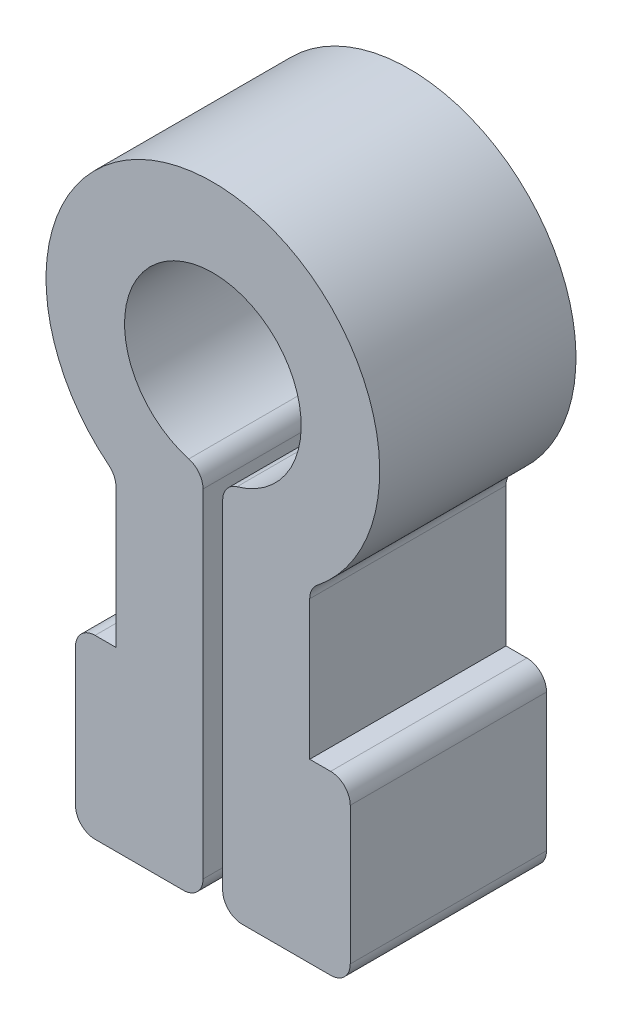
ISO-10303-21;
HEADER;
FILE_DESCRIPTION(('STEP AP214'),'2;1');
FILE_NAME('part.step','',(''),(''),'','','');
FILE_SCHEMA(('AUTOMOTIVE_DESIGN { 1 0 10303 214 1 1 1 1 }'));
ENDSEC;
DATA;
#1=APPLICATION_CONTEXT('core data for automotive mechanical design processes');
#2=APPLICATION_PROTOCOL_DEFINITION('international standard','automotive_design',2000,#1);
#3=PRODUCT_CONTEXT('',#1,'mechanical');
#4=PRODUCT('Part','Part','',(#3));
#5=PRODUCT_RELATED_PRODUCT_CATEGORY('part','',(#4));
#6=PRODUCT_DEFINITION_FORMATION('','',#4);
#7=PRODUCT_DEFINITION_CONTEXT('part definition',#1,'design');
#8=PRODUCT_DEFINITION('design','',#6,#7);
#9=PRODUCT_DEFINITION_SHAPE('','',#8);
#10=(LENGTH_UNIT() NAMED_UNIT(*) SI_UNIT(.MILLI.,.METRE.));
#11=(NAMED_UNIT(*) PLANE_ANGLE_UNIT() SI_UNIT($,.RADIAN.));
#12=(NAMED_UNIT(*) SI_UNIT($,.STERADIAN.) SOLID_ANGLE_UNIT());
#13=UNCERTAINTY_MEASURE_WITH_UNIT(LENGTH_MEASURE(1.E-05),#10,'distance_accuracy_value','');
#14=(GEOMETRIC_REPRESENTATION_CONTEXT(3) GLOBAL_UNCERTAINTY_ASSIGNED_CONTEXT((#13)) GLOBAL_UNIT_ASSIGNED_CONTEXT((#10,
#11,#12)) REPRESENTATION_CONTEXT('',''));
#15=CARTESIAN_POINT('',(0.,0.,0.));
#16=DIRECTION('',(0.,0.,1.));
#17=DIRECTION('',(1.,0.,0.));
#18=AXIS2_PLACEMENT_3D('',#15,#16,#17);
#19=CARTESIAN_POINT('',(1.5,-5.29150262212918,10.));
#20=DIRECTION('',(0.,0.,-1.));
#21=DIRECTION('',(-1.,0.,0.));
#22=AXIS2_PLACEMENT_3D('',#19,#20,#21);
#23=CYLINDRICAL_SURFACE('',#22,1.);
#24=CARTESIAN_POINT('',(1.5,-5.29150262212918,0.));
#25=DIRECTION('',(0.,0.,-1.));
#26=DIRECTION('',(-1.,0.,0.));
#27=AXIS2_PLACEMENT_3D('',#24,#25,#26);
#28=CIRCLE('',#27,1.);
#29=CARTESIAN_POINT('',(0.5,-5.29150262212918,0.));
#30=VERTEX_POINT('',#29);
#31=CARTESIAN_POINT('',(1.22727272727273,-4.32941123628751,0.));
#32=VERTEX_POINT('',#31);
#33=EDGE_CURVE('E223',#30,#32,#28,.T.);
#34=ORIENTED_EDGE('',*,*,#33,.F.);
#35=DIRECTION('',(0.,0.,-1.));
#36=VECTOR('',#35,1.);
#37=CARTESIAN_POINT('',(0.5,-5.29150262212918,10.));
#38=LINE('',#37,#36);
#39=CARTESIAN_POINT('',(0.5,-5.29150262212918,10.));
#40=VERTEX_POINT('',#39);
#41=EDGE_CURVE('E11',#40,#30,#38,.T.);
#42=ORIENTED_EDGE('',*,*,#41,.F.);
#43=CARTESIAN_POINT('',(1.5,-5.29150262212918,10.));
#44=DIRECTION('',(0.,0.,-1.));
#45=DIRECTION('',(-1.,0.,0.));
#46=AXIS2_PLACEMENT_3D('',#43,#44,#45);
#47=CIRCLE('',#46,1.);
#48=CARTESIAN_POINT('',(1.22727272727273,-4.32941123628751,10.));
#49=VERTEX_POINT('',#48);
#50=EDGE_CURVE('E299',#40,#49,#47,.T.);
#51=ORIENTED_EDGE('',*,*,#50,.T.);
#52=DIRECTION('',(0.,0.,-1.));
#53=VECTOR('',#52,1.);
#54=CARTESIAN_POINT('',(1.22727272727273,-4.32941123628751,10.));
#55=LINE('',#54,#53);
#56=EDGE_CURVE('E42',#49,#32,#55,.T.);
#57=ORIENTED_EDGE('',*,*,#56,.T.);
#58=EDGE_LOOP('',(#34,#42,#51,#57));
#59=FACE_BOUND('',#58,.T.);
#60=ADVANCED_FACE('F39',(#59),#23,.T.);
#61=CARTESIAN_POINT('',(0.5,-5.29150262212918,10.));
#62=DIRECTION('',(1.,0.,0.));
#63=DIRECTION('',(0.,1.,0.));
#64=AXIS2_PLACEMENT_3D('',#61,#62,#63);
#65=PLANE('',#64);
#66=DIRECTION('',(0.,-1.,0.));
#67=VECTOR('',#66,1.);
#68=CARTESIAN_POINT('',(0.5,-5.29150262212918,0.));
#69=LINE('',#68,#67);
#70=CARTESIAN_POINT('',(0.5,-22.5,0.));
#71=VERTEX_POINT('',#70);
#72=EDGE_CURVE('E297',#30,#71,#69,.T.);
#73=ORIENTED_EDGE('',*,*,#72,.T.);
#74=DIRECTION('',(0.,0.,-1.));
#75=VECTOR('',#74,1.);
#76=CARTESIAN_POINT('',(0.5,-22.5,10.));
#77=LINE('',#76,#75);
#78=CARTESIAN_POINT('',(0.5,-22.5,10.));
#79=VERTEX_POINT('',#78);
#80=EDGE_CURVE('E49',#79,#71,#77,.T.);
#81=ORIENTED_EDGE('',*,*,#80,.F.);
#82=DIRECTION('',(0.,-1.,0.));
#83=VECTOR('',#82,1.);
#84=CARTESIAN_POINT('',(0.5,-5.29150262212918,10.));
#85=LINE('',#84,#83);
#86=EDGE_CURVE('E216',#40,#79,#85,.T.);
#87=ORIENTED_EDGE('',*,*,#86,.F.);
#88=ORIENTED_EDGE('',*,*,#41,.T.);
#89=EDGE_LOOP('',(#73,#81,#87,#88));
#90=FACE_BOUND('',#89,.T.);
#91=ADVANCED_FACE('F367',(#90),#65,.F.);
#92=CARTESIAN_POINT('',(1.5,-22.5,10.));
#93=DIRECTION('',(0.,0.,-1.));
#94=DIRECTION('',(-1.,0.,0.));
#95=AXIS2_PLACEMENT_3D('',#92,#93,#94);
#96=CYLINDRICAL_SURFACE('',#95,1.);
#97=CARTESIAN_POINT('',(1.5,-22.5,0.));
#98=DIRECTION('',(0.,0.,-1.));
#99=DIRECTION('',(-1.,0.,0.));
#100=AXIS2_PLACEMENT_3D('',#97,#98,#99);
#101=CIRCLE('',#100,1.);
#102=CARTESIAN_POINT('',(1.50000000000001,-23.5,0.));
#103=VERTEX_POINT('',#102);
#104=EDGE_CURVE('E199',#103,#71,#101,.T.);
#105=ORIENTED_EDGE('',*,*,#104,.F.);
#106=DIRECTION('',(0.,0.,-1.));
#107=VECTOR('',#106,1.);
#108=CARTESIAN_POINT('',(1.50000000000001,-23.5,10.));
#109=LINE('',#108,#107);
#110=CARTESIAN_POINT('',(1.50000000000001,-23.5,10.));
#111=VERTEX_POINT('',#110);
#112=EDGE_CURVE('E193',#111,#103,#109,.T.);
#113=ORIENTED_EDGE('',*,*,#112,.F.);
#114=CARTESIAN_POINT('',(1.5,-22.5,10.));
#115=DIRECTION('',(0.,0.,-1.));
#116=DIRECTION('',(-1.,0.,0.));
#117=AXIS2_PLACEMENT_3D('',#114,#115,#116);
#118=CIRCLE('',#117,1.);
#119=EDGE_CURVE('E197',#111,#79,#118,.T.);
#120=ORIENTED_EDGE('',*,*,#119,.T.);
#121=ORIENTED_EDGE('',*,*,#80,.T.);
#122=EDGE_LOOP('',(#105,#113,#120,#121));
#123=FACE_BOUND('',#122,.T.);
#124=ADVANCED_FACE('F195',(#123),#96,.T.);
#125=CARTESIAN_POINT('',(1.50000000000001,-23.5,10.));
#126=DIRECTION('',(0.,1.,0.));
#127=DIRECTION('',(0.,0.,1.));
#128=AXIS2_PLACEMENT_3D('',#125,#126,#127);
#129=PLANE('',#128);
#130=DIRECTION('',(1.,0.,0.));
#131=VECTOR('',#130,1.);
#132=CARTESIAN_POINT('',(1.50000000000001,-23.5,0.));
#133=LINE('',#132,#131);
#134=CARTESIAN_POINT('',(5.99999999999999,-23.5,0.));
#135=VERTEX_POINT('',#134);
#136=EDGE_CURVE('E292',#103,#135,#133,.T.);
#137=ORIENTED_EDGE('',*,*,#136,.T.);
#138=DIRECTION('',(0.,0.,-1.));
#139=VECTOR('',#138,1.);
#140=CARTESIAN_POINT('',(5.99999999999999,-23.5,10.));
#141=LINE('',#140,#139);
#142=CARTESIAN_POINT('',(5.99999999999999,-23.5,10.));
#143=VERTEX_POINT('',#142);
#144=EDGE_CURVE('E203',#143,#135,#141,.T.);
#145=ORIENTED_EDGE('',*,*,#144,.F.);
#146=DIRECTION('',(1.,0.,0.));
#147=VECTOR('',#146,1.);
#148=CARTESIAN_POINT('',(1.50000000000001,-23.5,10.));
#149=LINE('',#148,#147);
#150=EDGE_CURVE('E206',#111,#143,#149,.T.);
#151=ORIENTED_EDGE('',*,*,#150,.F.);
#152=ORIENTED_EDGE('',*,*,#112,.T.);
#153=EDGE_LOOP('',(#137,#145,#151,#152));
#154=FACE_BOUND('',#153,.T.);
#155=ADVANCED_FACE('F207',(#154),#129,.F.);
#156=CARTESIAN_POINT('',(6.,-22.5,10.));
#157=DIRECTION('',(0.,0.,-1.));
#158=DIRECTION('',(-1.,0.,0.));
#159=AXIS2_PLACEMENT_3D('',#156,#157,#158);
#160=CYLINDRICAL_SURFACE('',#159,1.);
#161=CARTESIAN_POINT('',(6.,-22.5,0.));
#162=DIRECTION('',(0.,0.,1.));
#163=DIRECTION('',(1.,0.,0.));
#164=AXIS2_PLACEMENT_3D('',#161,#162,#163);
#165=CIRCLE('',#164,1.);
#166=CARTESIAN_POINT('',(7.,-22.5,0.));
#167=VERTEX_POINT('',#166);
#168=EDGE_CURVE('E289',#135,#167,#165,.T.);
#169=ORIENTED_EDGE('',*,*,#168,.T.);
#170=DIRECTION('',(0.,0.,-1.));
#171=VECTOR('',#170,1.);
#172=CARTESIAN_POINT('',(7.,-22.5,10.));
#173=LINE('',#172,#171);
#174=CARTESIAN_POINT('',(7.,-22.5,10.));
#175=VERTEX_POINT('',#174);
#176=EDGE_CURVE('E305',#175,#167,#173,.T.);
#177=ORIENTED_EDGE('',*,*,#176,.F.);
#178=CARTESIAN_POINT('',(6.,-22.5,10.));
#179=DIRECTION('',(0.,0.,1.));
#180=DIRECTION('',(1.,0.,0.));
#181=AXIS2_PLACEMENT_3D('',#178,#179,#180);
#182=CIRCLE('',#181,1.);
#183=EDGE_CURVE('E212',#143,#175,#182,.T.);
#184=ORIENTED_EDGE('',*,*,#183,.F.);
#185=ORIENTED_EDGE('',*,*,#144,.T.);
#186=EDGE_LOOP('',(#169,#177,#184,#185));
#187=FACE_BOUND('',#186,.T.);
#188=ADVANCED_FACE('F433',(#187),#160,.T.);
#189=CARTESIAN_POINT('',(7.,-22.5,10.));
#190=DIRECTION('',(-1.,0.,0.));
#191=DIRECTION('',(0.,0.,1.));
#192=AXIS2_PLACEMENT_3D('',#189,#190,#191);
#193=PLANE('',#192);
#194=DIRECTION('',(0.,1.,0.));
#195=VECTOR('',#194,1.);
#196=CARTESIAN_POINT('',(7.,-22.5,0.));
#197=LINE('',#196,#195);
#198=CARTESIAN_POINT('',(7.,-15.5,0.));
#199=VERTEX_POINT('',#198);
#200=EDGE_CURVE('E286',#167,#199,#197,.T.);
#201=ORIENTED_EDGE('',*,*,#200,.T.);
#202=DIRECTION('',(0.,0.,-1.));
#203=VECTOR('',#202,1.);
#204=CARTESIAN_POINT('',(7.,-15.5,10.));
#205=LINE('',#204,#203);
#206=CARTESIAN_POINT('',(7.,-15.5,10.));
#207=VERTEX_POINT('',#206);
#208=EDGE_CURVE('E309',#207,#199,#205,.T.);
#209=ORIENTED_EDGE('',*,*,#208,.F.);
#210=DIRECTION('',(0.,1.,0.));
#211=VECTOR('',#210,1.);
#212=CARTESIAN_POINT('',(7.,-22.5,10.));
#213=LINE('',#212,#211);
#214=EDGE_CURVE('E426',#175,#207,#213,.T.);
#215=ORIENTED_EDGE('',*,*,#214,.F.);
#216=ORIENTED_EDGE('',*,*,#176,.T.);
#217=EDGE_LOOP('',(#201,#209,#215,#216));
#218=FACE_BOUND('',#217,.T.);
#219=ADVANCED_FACE('F437',(#218),#193,.F.);
#220=CARTESIAN_POINT('',(6.,-15.5,10.));
#221=DIRECTION('',(0.,0.,-1.));
#222=DIRECTION('',(-1.,0.,0.));
#223=AXIS2_PLACEMENT_3D('',#220,#221,#222);
#224=CYLINDRICAL_SURFACE('',#223,1.);
#225=CARTESIAN_POINT('',(6.,-15.5,0.));
#226=DIRECTION('',(0.,0.,1.));
#227=DIRECTION('',(1.,0.,0.));
#228=AXIS2_PLACEMENT_3D('',#225,#226,#227);
#229=CIRCLE('',#228,1.);
#230=CARTESIAN_POINT('',(5.99999999999999,-14.5,0.));
#231=VERTEX_POINT('',#230);
#232=EDGE_CURVE('E283',#199,#231,#229,.T.);
#233=ORIENTED_EDGE('',*,*,#232,.T.);
#234=DIRECTION('',(0.,0.,-1.));
#235=VECTOR('',#234,1.);
#236=CARTESIAN_POINT('',(5.99999999999999,-14.5,10.));
#237=LINE('',#236,#235);
#238=CARTESIAN_POINT('',(5.99999999999999,-14.5,10.));
#239=VERTEX_POINT('',#238);
#240=EDGE_CURVE('E313',#239,#231,#237,.T.);
#241=ORIENTED_EDGE('',*,*,#240,.F.);
#242=CARTESIAN_POINT('',(6.,-15.5,10.));
#243=DIRECTION('',(0.,0.,1.));
#244=DIRECTION('',(1.,0.,0.));
#245=AXIS2_PLACEMENT_3D('',#242,#243,#244);
#246=CIRCLE('',#245,1.);
#247=EDGE_CURVE('E423',#207,#239,#246,.T.);
#248=ORIENTED_EDGE('',*,*,#247,.F.);
#249=ORIENTED_EDGE('',*,*,#208,.T.);
#250=EDGE_LOOP('',(#233,#241,#248,#249));
#251=FACE_BOUND('',#250,.T.);
#252=ADVANCED_FACE('F442',(#251),#224,.T.);
#253=CARTESIAN_POINT('',(5.99999999999999,-14.5,10.));
#254=DIRECTION('',(0.,-1.,0.));
#255=DIRECTION('',(0.,0.,-1.));
#256=AXIS2_PLACEMENT_3D('',#253,#254,#255);
#257=PLANE('',#256);
#258=DIRECTION('',(-1.,0.,0.));
#259=VECTOR('',#258,1.);
#260=CARTESIAN_POINT('',(5.99999999999999,-14.5,0.));
#261=LINE('',#260,#259);
#262=CARTESIAN_POINT('',(4.93459313893604,-14.5,0.));
#263=VERTEX_POINT('',#262);
#264=EDGE_CURVE('E280',#231,#263,#261,.T.);
#265=ORIENTED_EDGE('',*,*,#264,.T.);
#266=DIRECTION('',(0.,0.,-1.));
#267=VECTOR('',#266,1.);
#268=CARTESIAN_POINT('',(4.93459313893604,-14.5,10.));
#269=LINE('',#268,#267);
#270=CARTESIAN_POINT('',(4.93459313893604,-14.5,10.));
#271=VERTEX_POINT('',#270);
#272=EDGE_CURVE('E317',#271,#263,#269,.T.);
#273=ORIENTED_EDGE('',*,*,#272,.F.);
#274=DIRECTION('',(-1.,0.,0.));
#275=VECTOR('',#274,1.);
#276=CARTESIAN_POINT('',(5.99999999999999,-14.5,10.));
#277=LINE('',#276,#275);
#278=EDGE_CURVE('E420',#239,#271,#277,.T.);
#279=ORIENTED_EDGE('',*,*,#278,.F.);
#280=ORIENTED_EDGE('',*,*,#240,.T.);
#281=EDGE_LOOP('',(#265,#273,#279,#280));
#282=FACE_BOUND('',#281,.T.);
#283=ADVANCED_FACE('F448',(#282),#257,.F.);
#284=CARTESIAN_POINT('',(4.93459313893604,-14.5,10.));
#285=DIRECTION('',(-1.,0.,0.));
#286=DIRECTION('',(0.,0.,1.));
#287=AXIS2_PLACEMENT_3D('',#284,#285,#286);
#288=PLANE('',#287);
#289=DIRECTION('',(0.,1.,0.));
#290=VECTOR('',#289,1.);
#291=CARTESIAN_POINT('',(4.93459313893604,-14.5,0.));
#292=LINE('',#291,#290);
#293=CARTESIAN_POINT('',(4.93459313893604,-7.41826153996294,0.));
#294=VERTEX_POINT('',#293);
#295=EDGE_CURVE('E277',#263,#294,#292,.T.);
#296=ORIENTED_EDGE('',*,*,#295,.T.);
#297=DIRECTION('',(0.,0.,-1.));
#298=VECTOR('',#297,1.);
#299=CARTESIAN_POINT('',(4.93459313893604,-7.41826153996294,10.));
#300=LINE('',#299,#298);
#301=CARTESIAN_POINT('',(4.93459313893604,-7.41826153996294,10.));
#302=VERTEX_POINT('',#301);
#303=EDGE_CURVE('E321',#302,#294,#300,.T.);
#304=ORIENTED_EDGE('',*,*,#303,.F.);
#305=DIRECTION('',(0.,1.,0.));
#306=VECTOR('',#305,1.);
#307=CARTESIAN_POINT('',(4.93459313893604,-14.5,10.));
#308=LINE('',#307,#306);
#309=EDGE_CURVE('E417',#271,#302,#308,.T.);
#310=ORIENTED_EDGE('',*,*,#309,.F.);
#311=ORIENTED_EDGE('',*,*,#272,.T.);
#312=EDGE_LOOP('',(#296,#304,#310,#311));
#313=FACE_BOUND('',#312,.T.);
#314=ADVANCED_FACE('F452',(#313),#288,.F.);
#315=CARTESIAN_POINT('',(5.93459313893604,-7.41826153996294,10.));
#316=DIRECTION('',(0.,0.,-1.));
#317=DIRECTION('',(-1.,0.,0.));
#318=AXIS2_PLACEMENT_3D('',#315,#316,#317);
#319=CYLINDRICAL_SURFACE('',#318,1.);
#320=CARTESIAN_POINT('',(5.93459313893604,-7.41826153996294,0.));
#321=DIRECTION('',(0.,0.,-1.));
#322=DIRECTION('',(-1.,0.,0.));
#323=AXIS2_PLACEMENT_3D('',#320,#321,#322);
#324=CIRCLE('',#323,1.);
#325=CARTESIAN_POINT('',(5.30989912431119,-6.63739190417737,0.));
#326=VERTEX_POINT('',#325);
#327=EDGE_CURVE('E274',#294,#326,#324,.T.);
#328=ORIENTED_EDGE('',*,*,#327,.T.);
#329=DIRECTION('',(0.,0.,-1.));
#330=VECTOR('',#329,1.);
#331=CARTESIAN_POINT('',(5.30989912431119,-6.63739190417737,10.));
#332=LINE('',#331,#330);
#333=CARTESIAN_POINT('',(5.30989912431119,-6.63739190417737,10.));
#334=VERTEX_POINT('',#333);
#335=EDGE_CURVE('E325',#334,#326,#332,.T.);
#336=ORIENTED_EDGE('',*,*,#335,.F.);
#337=CARTESIAN_POINT('',(5.93459313893604,-7.41826153996294,10.));
#338=DIRECTION('',(0.,0.,-1.));
#339=DIRECTION('',(-1.,0.,0.));
#340=AXIS2_PLACEMENT_3D('',#337,#338,#339);
#341=CIRCLE('',#340,1.);
#342=EDGE_CURVE('E414',#302,#334,#341,.T.);
#343=ORIENTED_EDGE('',*,*,#342,.F.);
#344=ORIENTED_EDGE('',*,*,#303,.T.);
#345=EDGE_LOOP('',(#328,#336,#343,#344));
#346=FACE_BOUND('',#345,.T.);
#347=ADVANCED_FACE('F457',(#346),#319,.F.);
#348=CARTESIAN_POINT('',(0.,0.,10.));
#349=DIRECTION('',(0.,0.,-1.));
#350=DIRECTION('',(-1.,0.,0.));
#351=AXIS2_PLACEMENT_3D('',#348,#349,#350);
#352=CYLINDRICAL_SURFACE('',#351,8.5);
#353=CARTESIAN_POINT('',(0.,0.,0.));
#354=DIRECTION('',(0.,0.,1.));
#355=DIRECTION('',(1.,0.,0.));
#356=AXIS2_PLACEMENT_3D('',#353,#354,#355);
#357=CIRCLE('',#356,8.5);
#358=CARTESIAN_POINT('',(-5.30989912431119,-6.63739190417737,0.));
#359=VERTEX_POINT('',#358);
#360=EDGE_CURVE('E270',#326,#359,#357,.T.);
#361=ORIENTED_EDGE('',*,*,#360,.T.);
#362=DIRECTION('',(0.,0.,-1.));
#363=VECTOR('',#362,1.);
#364=CARTESIAN_POINT('',(-5.30989912431119,-6.63739190417737,10.));
#365=LINE('',#364,#363);
#366=CARTESIAN_POINT('',(-5.30989912431119,-6.63739190417737,10.));
#367=VERTEX_POINT('',#366);
#368=EDGE_CURVE('E329',#367,#359,#365,.T.);
#369=ORIENTED_EDGE('',*,*,#368,.F.);
#370=CARTESIAN_POINT('',(0.,0.,10.));
#371=DIRECTION('',(0.,0.,1.));
#372=DIRECTION('',(1.,0.,0.));
#373=AXIS2_PLACEMENT_3D('',#370,#371,#372);
#374=CIRCLE('',#373,8.5);
#375=EDGE_CURVE('E411',#334,#367,#374,.T.);
#376=ORIENTED_EDGE('',*,*,#375,.F.);
#377=ORIENTED_EDGE('',*,*,#335,.T.);
#378=EDGE_LOOP('',(#361,#369,#376,#377));
#379=FACE_BOUND('',#378,.T.);
#380=ADVANCED_FACE('F463',(#379),#352,.T.);
#381=CARTESIAN_POINT('',(-5.93459313893604,-7.41826153996294,10.));
#382=DIRECTION('',(0.,0.,-1.));
#383=DIRECTION('',(-1.,0.,0.));
#384=AXIS2_PLACEMENT_3D('',#381,#382,#383);
#385=CYLINDRICAL_SURFACE('',#384,1.);
#386=CARTESIAN_POINT('',(-5.93459313893604,-7.41826153996294,0.));
#387=DIRECTION('',(0.,0.,1.));
#388=DIRECTION('',(1.,0.,0.));
#389=AXIS2_PLACEMENT_3D('',#386,#387,#388);
#390=CIRCLE('',#389,1.);
#391=CARTESIAN_POINT('',(-4.93459313893604,-7.41826153996294,0.));
#392=VERTEX_POINT('',#391);
#393=EDGE_CURVE('E266',#392,#359,#390,.T.);
#394=ORIENTED_EDGE('',*,*,#393,.F.);
#395=DIRECTION('',(0.,0.,-1.));
#396=VECTOR('',#395,1.);
#397=CARTESIAN_POINT('',(-4.93459313893604,-7.41826153996294,10.));
#398=LINE('',#397,#396);
#399=CARTESIAN_POINT('',(-4.93459313893604,-7.41826153996294,10.));
#400=VERTEX_POINT('',#399);
#401=EDGE_CURVE('E332',#400,#392,#398,.T.);
#402=ORIENTED_EDGE('',*,*,#401,.F.);
#403=CARTESIAN_POINT('',(-5.93459313893604,-7.41826153996294,10.));
#404=DIRECTION('',(0.,0.,1.));
#405=DIRECTION('',(1.,0.,0.));
#406=AXIS2_PLACEMENT_3D('',#403,#404,#405);
#407=CIRCLE('',#406,1.);
#408=EDGE_CURVE('E407',#400,#367,#407,.T.);
#409=ORIENTED_EDGE('',*,*,#408,.T.);
#410=ORIENTED_EDGE('',*,*,#368,.T.);
#411=EDGE_LOOP('',(#394,#402,#409,#410));
#412=FACE_BOUND('',#411,.T.);
#413=ADVANCED_FACE('F467',(#412),#385,.F.);
#414=CARTESIAN_POINT('',(-4.93459313893604,-14.5,10.));
#415=DIRECTION('',(-1.,0.,0.));
#416=DIRECTION('',(0.,0.,1.));
#417=AXIS2_PLACEMENT_3D('',#414,#415,#416);
#418=PLANE('',#417);
#419=DIRECTION('',(0.,1.,0.));
#420=VECTOR('',#419,1.);
#421=CARTESIAN_POINT('',(-4.93459313893604,-14.5,0.));
#422=LINE('',#421,#420);
#423=CARTESIAN_POINT('',(-4.93459313893604,-14.5,0.));
#424=VERTEX_POINT('',#423);
#425=EDGE_CURVE('E262',#424,#392,#422,.T.);
#426=ORIENTED_EDGE('',*,*,#425,.F.);
#427=DIRECTION('',(0.,0.,-1.));
#428=VECTOR('',#427,1.);
#429=CARTESIAN_POINT('',(-4.93459313893604,-14.5,10.));
#430=LINE('',#429,#428);
#431=CARTESIAN_POINT('',(-4.93459313893604,-14.5,10.));
#432=VERTEX_POINT('',#431);
#433=EDGE_CURVE('E335',#432,#424,#430,.T.);
#434=ORIENTED_EDGE('',*,*,#433,.F.);
#435=DIRECTION('',(0.,1.,0.));
#436=VECTOR('',#435,1.);
#437=CARTESIAN_POINT('',(-4.93459313893604,-14.5,10.));
#438=LINE('',#437,#436);
#439=EDGE_CURVE('E403',#432,#400,#438,.T.);
#440=ORIENTED_EDGE('',*,*,#439,.T.);
#441=ORIENTED_EDGE('',*,*,#401,.T.);
#442=EDGE_LOOP('',(#426,#434,#440,#441));
#443=FACE_BOUND('',#442,.T.);
#444=ADVANCED_FACE('F470',(#443),#418,.T.);
#445=CARTESIAN_POINT('',(-5.99999999999999,-14.5,10.));
#446=DIRECTION('',(0.,1.,0.));
#447=DIRECTION('',(0.,0.,1.));
#448=AXIS2_PLACEMENT_3D('',#445,#446,#447);
#449=PLANE('',#448);
#450=DIRECTION('',(1.,0.,0.));
#451=VECTOR('',#450,1.);
#452=CARTESIAN_POINT('',(-5.99999999999999,-14.5,0.));
#453=LINE('',#452,#451);
#454=CARTESIAN_POINT('',(-5.99999999999999,-14.5,0.));
#455=VERTEX_POINT('',#454);
#456=EDGE_CURVE('E258',#455,#424,#453,.T.);
#457=ORIENTED_EDGE('',*,*,#456,.F.);
#458=DIRECTION('',(0.,0.,-1.));
#459=VECTOR('',#458,1.);
#460=CARTESIAN_POINT('',(-5.99999999999999,-14.5,10.));
#461=LINE('',#460,#459);
#462=CARTESIAN_POINT('',(-5.99999999999999,-14.5,10.));
#463=VERTEX_POINT('',#462);
#464=EDGE_CURVE('E338',#463,#455,#461,.T.);
#465=ORIENTED_EDGE('',*,*,#464,.F.);
#466=DIRECTION('',(1.,0.,0.));
#467=VECTOR('',#466,1.);
#468=CARTESIAN_POINT('',(-5.99999999999999,-14.5,10.));
#469=LINE('',#468,#467);
#470=EDGE_CURVE('E399',#463,#432,#469,.T.);
#471=ORIENTED_EDGE('',*,*,#470,.T.);
#472=ORIENTED_EDGE('',*,*,#433,.T.);
#473=EDGE_LOOP('',(#457,#465,#471,#472));
#474=FACE_BOUND('',#473,.T.);
#475=ADVANCED_FACE('F475',(#474),#449,.T.);
#476=CARTESIAN_POINT('',(-6.,-15.5,10.));
#477=DIRECTION('',(0.,0.,-1.));
#478=DIRECTION('',(-1.,0.,0.));
#479=AXIS2_PLACEMENT_3D('',#476,#477,#478);
#480=CYLINDRICAL_SURFACE('',#479,1.);
#481=CARTESIAN_POINT('',(-6.,-15.5,0.));
#482=DIRECTION('',(0.,0.,-1.));
#483=DIRECTION('',(-1.,0.,0.));
#484=AXIS2_PLACEMENT_3D('',#481,#482,#483);
#485=CIRCLE('',#484,1.);
#486=CARTESIAN_POINT('',(-7.,-15.5,0.));
#487=VERTEX_POINT('',#486);
#488=EDGE_CURVE('E254',#487,#455,#485,.T.);
#489=ORIENTED_EDGE('',*,*,#488,.F.);
#490=DIRECTION('',(0.,0.,-1.));
#491=VECTOR('',#490,1.);
#492=CARTESIAN_POINT('',(-7.,-15.5,10.));
#493=LINE('',#492,#491);
#494=CARTESIAN_POINT('',(-7.,-15.5,10.));
#495=VERTEX_POINT('',#494);
#496=EDGE_CURVE('E341',#495,#487,#493,.T.);
#497=ORIENTED_EDGE('',*,*,#496,.F.);
#498=CARTESIAN_POINT('',(-6.,-15.5,10.));
#499=DIRECTION('',(0.,0.,-1.));
#500=DIRECTION('',(-1.,0.,0.));
#501=AXIS2_PLACEMENT_3D('',#498,#499,#500);
#502=CIRCLE('',#501,1.);
#503=EDGE_CURVE('E395',#495,#463,#502,.T.);
#504=ORIENTED_EDGE('',*,*,#503,.T.);
#505=ORIENTED_EDGE('',*,*,#464,.T.);
#506=EDGE_LOOP('',(#489,#497,#504,#505));
#507=FACE_BOUND('',#506,.T.);
#508=ADVANCED_FACE('F478',(#507),#480,.T.);
#509=CARTESIAN_POINT('',(-7.,-22.5,10.));
#510=DIRECTION('',(-1.,0.,0.));
#511=DIRECTION('',(0.,0.,1.));
#512=AXIS2_PLACEMENT_3D('',#509,#510,#511);
#513=PLANE('',#512);
#514=DIRECTION('',(0.,1.,0.));
#515=VECTOR('',#514,1.);
#516=CARTESIAN_POINT('',(-7.,-22.5,0.));
#517=LINE('',#516,#515);
#518=CARTESIAN_POINT('',(-7.,-22.5,0.));
#519=VERTEX_POINT('',#518);
#520=EDGE_CURVE('E250',#519,#487,#517,.T.);
#521=ORIENTED_EDGE('',*,*,#520,.F.);
#522=DIRECTION('',(0.,0.,-1.));
#523=VECTOR('',#522,1.);
#524=CARTESIAN_POINT('',(-7.,-22.5,10.));
#525=LINE('',#524,#523);
#526=CARTESIAN_POINT('',(-7.,-22.5,10.));
#527=VERTEX_POINT('',#526);
#528=EDGE_CURVE('E344',#527,#519,#525,.T.);
#529=ORIENTED_EDGE('',*,*,#528,.F.);
#530=DIRECTION('',(0.,1.,0.));
#531=VECTOR('',#530,1.);
#532=CARTESIAN_POINT('',(-7.,-22.5,10.));
#533=LINE('',#532,#531);
#534=EDGE_CURVE('E391',#527,#495,#533,.T.);
#535=ORIENTED_EDGE('',*,*,#534,.T.);
#536=ORIENTED_EDGE('',*,*,#496,.T.);
#537=EDGE_LOOP('',(#521,#529,#535,#536));
#538=FACE_BOUND('',#537,.T.);
#539=ADVANCED_FACE('F483',(#538),#513,.T.);
#540=CARTESIAN_POINT('',(-6.,-22.5,10.));
#541=DIRECTION('',(0.,0.,-1.));
#542=DIRECTION('',(-1.,0.,0.));
#543=AXIS2_PLACEMENT_3D('',#540,#541,#542);
#544=CYLINDRICAL_SURFACE('',#543,1.);
#545=CARTESIAN_POINT('',(-6.,-22.5,0.));
#546=DIRECTION('',(0.,0.,-1.));
#547=DIRECTION('',(-1.,0.,0.));
#548=AXIS2_PLACEMENT_3D('',#545,#546,#547);
#549=CIRCLE('',#548,1.);
#550=CARTESIAN_POINT('',(-5.99999999999999,-23.5,0.));
#551=VERTEX_POINT('',#550);
#552=EDGE_CURVE('E246',#551,#519,#549,.T.);
#553=ORIENTED_EDGE('',*,*,#552,.F.);
#554=DIRECTION('',(0.,0.,-1.));
#555=VECTOR('',#554,1.);
#556=CARTESIAN_POINT('',(-5.99999999999999,-23.5,10.));
#557=LINE('',#556,#555);
#558=CARTESIAN_POINT('',(-5.99999999999999,-23.5,10.));
#559=VERTEX_POINT('',#558);
#560=EDGE_CURVE('E347',#559,#551,#557,.T.);
#561=ORIENTED_EDGE('',*,*,#560,.F.);
#562=CARTESIAN_POINT('',(-6.,-22.5,10.));
#563=DIRECTION('',(0.,0.,-1.));
#564=DIRECTION('',(-1.,0.,0.));
#565=AXIS2_PLACEMENT_3D('',#562,#563,#564);
#566=CIRCLE('',#565,1.);
#567=EDGE_CURVE('E387',#559,#527,#566,.T.);
#568=ORIENTED_EDGE('',*,*,#567,.T.);
#569=ORIENTED_EDGE('',*,*,#528,.T.);
#570=EDGE_LOOP('',(#553,#561,#568,#569));
#571=FACE_BOUND('',#570,.T.);
#572=ADVANCED_FACE('F486',(#571),#544,.T.);
#573=CARTESIAN_POINT('',(-5.99999999999999,-23.5,10.));
#574=DIRECTION('',(0.,1.,0.));
#575=DIRECTION('',(0.,0.,1.));
#576=AXIS2_PLACEMENT_3D('',#573,#574,#575);
#577=PLANE('',#576);
#578=DIRECTION('',(1.,0.,0.));
#579=VECTOR('',#578,1.);
#580=CARTESIAN_POINT('',(-5.99999999999999,-23.5,0.));
#581=LINE('',#580,#579);
#582=CARTESIAN_POINT('',(-1.50000000000001,-23.5,0.));
#583=VERTEX_POINT('',#582);
#584=EDGE_CURVE('E243',#551,#583,#581,.T.);
#585=ORIENTED_EDGE('',*,*,#584,.T.);
#586=DIRECTION('',(0.,0.,-1.));
#587=VECTOR('',#586,1.);
#588=CARTESIAN_POINT('',(-1.50000000000001,-23.5,10.));
#589=LINE('',#588,#587);
#590=CARTESIAN_POINT('',(-1.50000000000001,-23.5,10.));
#591=VERTEX_POINT('',#590);
#592=EDGE_CURVE('E350',#591,#583,#589,.T.);
#593=ORIENTED_EDGE('',*,*,#592,.F.);
#594=DIRECTION('',(1.,0.,0.));
#595=VECTOR('',#594,1.);
#596=CARTESIAN_POINT('',(-5.99999999999999,-23.5,10.));
#597=LINE('',#596,#595);
#598=EDGE_CURVE('E384',#559,#591,#597,.T.);
#599=ORIENTED_EDGE('',*,*,#598,.F.);
#600=ORIENTED_EDGE('',*,*,#560,.T.);
#601=EDGE_LOOP('',(#585,#593,#599,#600));
#602=FACE_BOUND('',#601,.T.);
#603=ADVANCED_FACE('F493',(#602),#577,.F.);
#604=CARTESIAN_POINT('',(-1.5,-22.5,10.));
#605=DIRECTION('',(0.,0.,-1.));
#606=DIRECTION('',(-1.,0.,0.));
#607=AXIS2_PLACEMENT_3D('',#604,#605,#606);
#608=CYLINDRICAL_SURFACE('',#607,1.);
#609=CARTESIAN_POINT('',(-1.5,-22.5,0.));
#610=DIRECTION('',(0.,0.,1.));
#611=DIRECTION('',(1.,0.,0.));
#612=AXIS2_PLACEMENT_3D('',#609,#610,#611);
#613=CIRCLE('',#612,1.);
#614=CARTESIAN_POINT('',(-0.5,-22.5,0.));
#615=VERTEX_POINT('',#614);
#616=EDGE_CURVE('E239',#583,#615,#613,.T.);
#617=ORIENTED_EDGE('',*,*,#616,.T.);
#618=DIRECTION('',(0.,0.,-1.));
#619=VECTOR('',#618,1.);
#620=CARTESIAN_POINT('',(-0.5,-22.5,10.));
#621=LINE('',#620,#619);
#622=CARTESIAN_POINT('',(-0.5,-22.5,10.));
#623=VERTEX_POINT('',#622);
#624=EDGE_CURVE('E354',#623,#615,#621,.T.);
#625=ORIENTED_EDGE('',*,*,#624,.F.);
#626=CARTESIAN_POINT('',(-1.5,-22.5,10.));
#627=DIRECTION('',(0.,0.,1.));
#628=DIRECTION('',(1.,0.,0.));
#629=AXIS2_PLACEMENT_3D('',#626,#627,#628);
#630=CIRCLE('',#629,1.);
#631=EDGE_CURVE('E381',#591,#623,#630,.T.);
#632=ORIENTED_EDGE('',*,*,#631,.F.);
#633=ORIENTED_EDGE('',*,*,#592,.T.);
#634=EDGE_LOOP('',(#617,#625,#632,#633));
#635=FACE_BOUND('',#634,.T.);
#636=ADVANCED_FACE('F497',(#635),#608,.T.);
#637=CARTESIAN_POINT('',(-0.5,-5.29150262212918,10.));
#638=DIRECTION('',(1.,0.,0.));
#639=DIRECTION('',(0.,1.,0.));
#640=AXIS2_PLACEMENT_3D('',#637,#638,#639);
#641=PLANE('',#640);
#642=DIRECTION('',(0.,-1.,0.));
#643=VECTOR('',#642,1.);
#644=CARTESIAN_POINT('',(-0.5,-5.29150262212918,0.));
#645=LINE('',#644,#643);
#646=CARTESIAN_POINT('',(-0.5,-5.29150262212918,0.));
#647=VERTEX_POINT('',#646);
#648=EDGE_CURVE('E235',#647,#615,#645,.T.);
#649=ORIENTED_EDGE('',*,*,#648,.F.);
#650=DIRECTION('',(0.,0.,-1.));
#651=VECTOR('',#650,1.);
#652=CARTESIAN_POINT('',(-0.5,-5.29150262212918,10.));
#653=LINE('',#652,#651);
#654=CARTESIAN_POINT('',(-0.5,-5.29150262212918,10.));
#655=VERTEX_POINT('',#654);
#656=EDGE_CURVE('E357',#655,#647,#653,.T.);
#657=ORIENTED_EDGE('',*,*,#656,.F.);
#658=DIRECTION('',(0.,-1.,0.));
#659=VECTOR('',#658,1.);
#660=CARTESIAN_POINT('',(-0.5,-5.29150262212918,10.));
#661=LINE('',#660,#659);
#662=EDGE_CURVE('E377',#655,#623,#661,.T.);
#663=ORIENTED_EDGE('',*,*,#662,.T.);
#664=ORIENTED_EDGE('',*,*,#624,.T.);
#665=EDGE_LOOP('',(#649,#657,#663,#664));
#666=FACE_BOUND('',#665,.T.);
#667=ADVANCED_FACE('F500',(#666),#641,.T.);
#668=CARTESIAN_POINT('',(-1.5,-5.29150262212918,10.));
#669=DIRECTION('',(0.,0.,-1.));
#670=DIRECTION('',(-1.,0.,0.));
#671=AXIS2_PLACEMENT_3D('',#668,#669,#670);
#672=CYLINDRICAL_SURFACE('',#671,1.);
#673=CARTESIAN_POINT('',(-1.5,-5.29150262212918,0.));
#674=DIRECTION('',(0.,0.,1.));
#675=DIRECTION('',(1.,0.,0.));
#676=AXIS2_PLACEMENT_3D('',#673,#674,#675);
#677=CIRCLE('',#676,1.);
#678=CARTESIAN_POINT('',(-1.22727272727273,-4.32941123628751,0.));
#679=VERTEX_POINT('',#678);
#680=EDGE_CURVE('E231',#647,#679,#677,.T.);
#681=ORIENTED_EDGE('',*,*,#680,.T.);
#682=DIRECTION('',(0.,0.,-1.));
#683=VECTOR('',#682,1.);
#684=CARTESIAN_POINT('',(-1.22727272727273,-4.32941123628751,10.));
#685=LINE('',#684,#683);
#686=CARTESIAN_POINT('',(-1.22727272727273,-4.32941123628751,10.));
#687=VERTEX_POINT('',#686);
#688=EDGE_CURVE('E359',#687,#679,#685,.T.);
#689=ORIENTED_EDGE('',*,*,#688,.F.);
#690=CARTESIAN_POINT('',(-1.5,-5.29150262212918,10.));
#691=DIRECTION('',(0.,0.,1.));
#692=DIRECTION('',(1.,0.,0.));
#693=AXIS2_PLACEMENT_3D('',#690,#691,#692);
#694=CIRCLE('',#693,1.);
#695=EDGE_CURVE('E372',#655,#687,#694,.T.);
#696=ORIENTED_EDGE('',*,*,#695,.F.);
#697=ORIENTED_EDGE('',*,*,#656,.T.);
#698=EDGE_LOOP('',(#681,#689,#696,#697));
#699=FACE_BOUND('',#698,.T.);
#700=ADVANCED_FACE('F503',(#699),#672,.T.);
#701=CARTESIAN_POINT('',(0.,0.,10.));
#702=DIRECTION('',(0.,0.,-1.));
#703=DIRECTION('',(-1.,0.,0.));
#704=AXIS2_PLACEMENT_3D('',#701,#702,#703);
#705=CYLINDRICAL_SURFACE('',#704,4.5);
#706=CARTESIAN_POINT('',(0.,0.,0.));
#707=DIRECTION('',(0.,0.,1.));
#708=DIRECTION('',(1.,0.,0.));
#709=AXIS2_PLACEMENT_3D('',#706,#707,#708);
#710=CIRCLE('',#709,4.5);
#711=EDGE_CURVE('E227',#32,#679,#710,.T.);
#712=ORIENTED_EDGE('',*,*,#711,.F.);
#713=ORIENTED_EDGE('',*,*,#56,.F.);
#714=CARTESIAN_POINT('',(0.,0.,10.));
#715=DIRECTION('',(0.,0.,1.));
#716=DIRECTION('',(1.,0.,0.));
#717=AXIS2_PLACEMENT_3D('',#714,#715,#716);
#718=CIRCLE('',#717,4.5);
#719=EDGE_CURVE('E368',#49,#687,#718,.T.);
#720=ORIENTED_EDGE('',*,*,#719,.T.);
#721=ORIENTED_EDGE('',*,*,#688,.T.);
#722=EDGE_LOOP('',(#712,#713,#720,#721));
#723=FACE_BOUND('',#722,.T.);
#724=ADVANCED_FACE('F363',(#723),#705,.F.);
#725=CARTESIAN_POINT('',(1.5,-5.29150262212918,10.));
#726=DIRECTION('',(0.,0.,-1.));
#727=DIRECTION('',(-1.,0.,0.));
#728=AXIS2_PLACEMENT_3D('',#725,#726,#727);
#729=PLANE('',#728);
#730=ORIENTED_EDGE('',*,*,#50,.F.);
#731=ORIENTED_EDGE('',*,*,#86,.T.);
#732=ORIENTED_EDGE('',*,*,#119,.F.);
#733=ORIENTED_EDGE('',*,*,#150,.T.);
#734=ORIENTED_EDGE('',*,*,#183,.T.);
#735=ORIENTED_EDGE('',*,*,#214,.T.);
#736=ORIENTED_EDGE('',*,*,#247,.T.);
#737=ORIENTED_EDGE('',*,*,#278,.T.);
#738=ORIENTED_EDGE('',*,*,#309,.T.);
#739=ORIENTED_EDGE('',*,*,#342,.T.);
#740=ORIENTED_EDGE('',*,*,#375,.T.);
#741=ORIENTED_EDGE('',*,*,#408,.F.);
#742=ORIENTED_EDGE('',*,*,#439,.F.);
#743=ORIENTED_EDGE('',*,*,#470,.F.);
#744=ORIENTED_EDGE('',*,*,#503,.F.);
#745=ORIENTED_EDGE('',*,*,#534,.F.);
#746=ORIENTED_EDGE('',*,*,#567,.F.);
#747=ORIENTED_EDGE('',*,*,#598,.T.);
#748=ORIENTED_EDGE('',*,*,#631,.T.);
#749=ORIENTED_EDGE('',*,*,#662,.F.);
#750=ORIENTED_EDGE('',*,*,#695,.T.);
#751=ORIENTED_EDGE('',*,*,#719,.F.);
#752=EDGE_LOOP('',(#730,#731,#732,#733,#734,#735,#736,#737,#738,#739,#740,#741,#742,#743,#744,
#745,#746,#747,#748,#749,#750,#751));
#753=FACE_BOUND('',#752,.T.);
#754=ADVANCED_FACE('F215',(#753),#729,.F.);
#755=CARTESIAN_POINT('',(1.5,-5.29150262212918,0.));
#756=DIRECTION('',(0.,0.,-1.));
#757=DIRECTION('',(-1.,0.,0.));
#758=AXIS2_PLACEMENT_3D('',#755,#756,#757);
#759=PLANE('',#758);
#760=ORIENTED_EDGE('',*,*,#33,.T.);
#761=ORIENTED_EDGE('',*,*,#711,.T.);
#762=ORIENTED_EDGE('',*,*,#680,.F.);
#763=ORIENTED_EDGE('',*,*,#648,.T.);
#764=ORIENTED_EDGE('',*,*,#616,.F.);
#765=ORIENTED_EDGE('',*,*,#584,.F.);
#766=ORIENTED_EDGE('',*,*,#552,.T.);
#767=ORIENTED_EDGE('',*,*,#520,.T.);
#768=ORIENTED_EDGE('',*,*,#488,.T.);
#769=ORIENTED_EDGE('',*,*,#456,.T.);
#770=ORIENTED_EDGE('',*,*,#425,.T.);
#771=ORIENTED_EDGE('',*,*,#393,.T.);
#772=ORIENTED_EDGE('',*,*,#360,.F.);
#773=ORIENTED_EDGE('',*,*,#327,.F.);
#774=ORIENTED_EDGE('',*,*,#295,.F.);
#775=ORIENTED_EDGE('',*,*,#264,.F.);
#776=ORIENTED_EDGE('',*,*,#232,.F.);
#777=ORIENTED_EDGE('',*,*,#200,.F.);
#778=ORIENTED_EDGE('',*,*,#168,.F.);
#779=ORIENTED_EDGE('',*,*,#136,.F.);
#780=ORIENTED_EDGE('',*,*,#104,.T.);
#781=ORIENTED_EDGE('',*,*,#72,.F.);
#782=EDGE_LOOP('',(#760,#761,#762,#763,#764,#765,#766,#767,#768,#769,#770,#771,#772,#773,#774,
#775,#776,#777,#778,#779,#780,#781));
#783=FACE_BOUND('',#782,.T.);
#784=ADVANCED_FACE('F366',(#783),#759,.T.);
#785=CLOSED_SHELL('',(#60,#91,#124,#155,#188,#219,#252,#283,#314,#347,#380,#413,#444,#475,#508,
#539,#572,#603,#636,#667,#700,#724,#754,#784));
#786=MANIFOLD_SOLID_BREP('B2',#785);
#787=ADVANCED_BREP_SHAPE_REPRESENTATION('',(#18,#786),#14);
#788=SHAPE_DEFINITION_REPRESENTATION(#9,#787);
ENDSEC;
END-ISO-10303-21;
